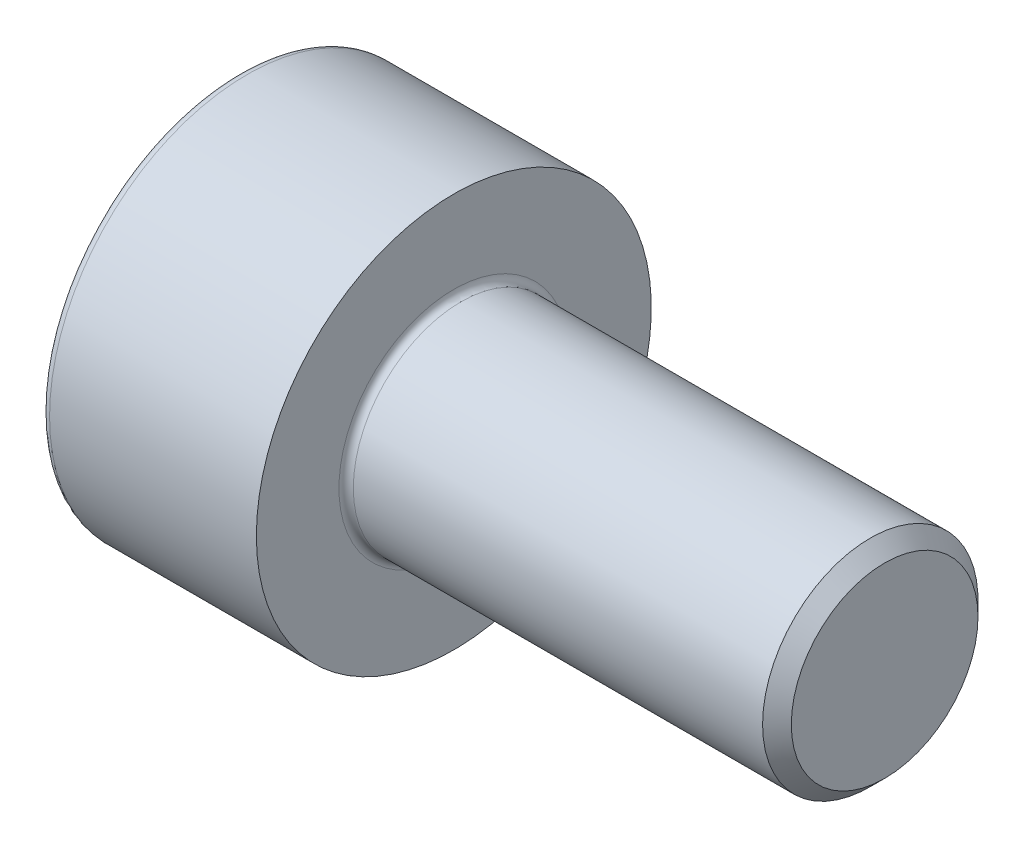
ISO-10303-21;
HEADER;
FILE_DESCRIPTION(('STEP AP214'),'2;1');
FILE_NAME('part.step','',(''),(''),'','','');
FILE_SCHEMA(('AUTOMOTIVE_DESIGN { 1 0 10303 214 1 1 1 1 }'));
ENDSEC;
DATA;
#1=APPLICATION_CONTEXT('core data for automotive mechanical design processes');
#2=APPLICATION_PROTOCOL_DEFINITION('international standard','automotive_design',2000,#1);
#3=PRODUCT_CONTEXT('',#1,'mechanical');
#4=PRODUCT('Part','Part','',(#3));
#5=PRODUCT_RELATED_PRODUCT_CATEGORY('part','',(#4));
#6=PRODUCT_DEFINITION_FORMATION('','',#4);
#7=PRODUCT_DEFINITION_CONTEXT('part definition',#1,'design');
#8=PRODUCT_DEFINITION('design','',#6,#7);
#9=PRODUCT_DEFINITION_SHAPE('','',#8);
#10=(LENGTH_UNIT() NAMED_UNIT(*) SI_UNIT(.MILLI.,.METRE.));
#11=(NAMED_UNIT(*) PLANE_ANGLE_UNIT() SI_UNIT($,.RADIAN.));
#12=(NAMED_UNIT(*) SI_UNIT($,.STERADIAN.) SOLID_ANGLE_UNIT());
#13=UNCERTAINTY_MEASURE_WITH_UNIT(LENGTH_MEASURE(1.E-05),#10,'distance_accuracy_value','');
#14=(GEOMETRIC_REPRESENTATION_CONTEXT(3) GLOBAL_UNCERTAINTY_ASSIGNED_CONTEXT((#13)) GLOBAL_UNIT_ASSIGNED_CONTEXT((#10,
#11,#12)) REPRESENTATION_CONTEXT('',''));
#15=CARTESIAN_POINT('',(0.,0.,0.));
#16=DIRECTION('',(0.,0.,1.));
#17=DIRECTION('',(1.,0.,0.));
#18=AXIS2_PLACEMENT_3D('',#15,#16,#17);
#19=CARTESIAN_POINT('',(9.,0.,0.));
#20=DIRECTION('',(-1.,0.,0.));
#21=DIRECTION('',(0.,0.,1.));
#22=AXIS2_PLACEMENT_3D('',#19,#20,#21);
#23=PLANE('',#22);
#24=CARTESIAN_POINT('',(9.,0.,0.));
#25=DIRECTION('',(-1.,0.,0.));
#26=DIRECTION('',(0.,0.,1.));
#27=AXIS2_PLACEMENT_3D('',#24,#25,#26);
#28=CIRCLE('',#27,1.3);
#29=CARTESIAN_POINT('',(9.,0.,1.3));
#30=VERTEX_POINT('',#29);
#31=EDGE_CURVE('E11',#30,#30,#28,.F.);
#32=ORIENTED_EDGE('',*,*,#31,.T.);
#33=EDGE_LOOP('',(#32));
#34=FACE_BOUND('',#33,.T.);
#35=ADVANCED_FACE('F37',(#34),#23,.F.);
#36=CARTESIAN_POINT('',(0.,0.,0.));
#37=DIRECTION('',(-1.,0.,0.));
#38=DIRECTION('',(0.,0.,1.));
#39=AXIS2_PLACEMENT_3D('',#36,#37,#38);
#40=CYLINDRICAL_SURFACE('',#39,1.5);
#41=CARTESIAN_POINT('',(8.8,0.,0.));
#42=DIRECTION('',(-1.,0.,0.));
#43=DIRECTION('',(0.,0.,1.));
#44=AXIS2_PLACEMENT_3D('',#41,#42,#43);
#45=CIRCLE('',#44,1.5);
#46=CARTESIAN_POINT('',(8.8,0.,1.5));
#47=VERTEX_POINT('',#46);
#48=EDGE_CURVE('E45',#47,#47,#45,.T.);
#49=ORIENTED_EDGE('',*,*,#48,.T.);
#50=EDGE_LOOP('',(#49));
#51=FACE_BOUND('',#50,.T.);
#52=CARTESIAN_POINT('',(3.1,0.,0.));
#53=DIRECTION('',(1.,0.,0.));
#54=DIRECTION('',(0.,0.,-1.));
#55=AXIS2_PLACEMENT_3D('',#52,#53,#54);
#56=CIRCLE('',#55,1.5);
#57=CARTESIAN_POINT('',(3.1,0.,-1.5));
#58=VERTEX_POINT('',#57);
#59=EDGE_CURVE('E150',#58,#58,#56,.T.);
#60=ORIENTED_EDGE('',*,*,#59,.T.);
#61=EDGE_LOOP('',(#60));
#62=FACE_BOUND('',#61,.T.);
#63=ADVANCED_FACE('F161',(#51,#62),#40,.T.);
#64=CARTESIAN_POINT('',(3.,0.,0.));
#65=DIRECTION('',(1.,0.,0.));
#66=DIRECTION('',(0.,0.,-1.));
#67=AXIS2_PLACEMENT_3D('',#64,#65,#66);
#68=PLANE('',#67);
#69=CARTESIAN_POINT('',(3.,0.,0.));
#70=DIRECTION('',(1.,0.,0.));
#71=DIRECTION('',(0.,0.,-1.));
#72=AXIS2_PLACEMENT_3D('',#69,#70,#71);
#73=CIRCLE('',#72,1.6);
#74=CARTESIAN_POINT('',(3.,0.,-1.6));
#75=VERTEX_POINT('',#74);
#76=EDGE_CURVE('E147',#75,#75,#73,.F.);
#77=ORIENTED_EDGE('',*,*,#76,.T.);
#78=EDGE_LOOP('',(#77));
#79=FACE_BOUND('',#78,.T.);
#80=CARTESIAN_POINT('',(3.,0.,0.));
#81=DIRECTION('',(-1.,0.,0.));
#82=DIRECTION('',(0.,0.,1.));
#83=AXIS2_PLACEMENT_3D('',#80,#81,#82);
#84=CIRCLE('',#83,2.75);
#85=CARTESIAN_POINT('',(3.,0.,2.75));
#86=VERTEX_POINT('',#85);
#87=EDGE_CURVE('E139',#86,#86,#84,.T.);
#88=ORIENTED_EDGE('',*,*,#87,.F.);
#89=EDGE_LOOP('',(#88));
#90=FACE_BOUND('',#89,.T.);
#91=ADVANCED_FACE('F183',(#79,#90),#68,.T.);
#92=CARTESIAN_POINT('',(0.,0.,0.));
#93=DIRECTION('',(-1.,0.,0.));
#94=DIRECTION('',(0.,0.,1.));
#95=AXIS2_PLACEMENT_3D('',#92,#93,#94);
#96=CYLINDRICAL_SURFACE('',#95,2.75);
#97=CARTESIAN_POINT('',(0.12,0.,0.));
#98=DIRECTION('',(-1.,0.,0.));
#99=DIRECTION('',(0.,0.,1.));
#100=AXIS2_PLACEMENT_3D('',#97,#98,#99);
#101=CIRCLE('',#100,2.75);
#102=CARTESIAN_POINT('',(0.12,0.,2.75));
#103=VERTEX_POINT('',#102);
#104=EDGE_CURVE('E156',#103,#103,#101,.F.);
#105=ORIENTED_EDGE('',*,*,#104,.T.);
#106=EDGE_LOOP('',(#105));
#107=FACE_BOUND('',#106,.T.);
#108=ORIENTED_EDGE('',*,*,#87,.T.);
#109=EDGE_LOOP('',(#108));
#110=FACE_BOUND('',#109,.T.);
#111=ADVANCED_FACE('F193',(#107,#110),#96,.T.);
#112=CARTESIAN_POINT('',(0.,0.,0.));
#113=DIRECTION('',(-1.,0.,0.));
#114=DIRECTION('',(0.,0.,1.));
#115=AXIS2_PLACEMENT_3D('',#112,#113,#114);
#116=PLANE('',#115);
#117=DIRECTION('',(0.,0.5,-0.866025403784439));
#118=VECTOR('',#117,1.);
#119=CARTESIAN_POINT('',(0.,0.721687836487033,1.25));
#120=LINE('',#119,#118);
#121=CARTESIAN_POINT('',(0.,0.721687836487033,1.25));
#122=VERTEX_POINT('',#121);
#123=CARTESIAN_POINT('',(0.,1.44337567297406,0.));
#124=VERTEX_POINT('',#123);
#125=EDGE_CURVE('E52',#122,#124,#120,.T.);
#126=ORIENTED_EDGE('',*,*,#125,.F.);
#127=DIRECTION('',(0.,1.,0.));
#128=VECTOR('',#127,1.);
#129=CARTESIAN_POINT('',(0.,-0.721687836487032,1.25));
#130=LINE('',#129,#128);
#131=CARTESIAN_POINT('',(0.,-0.721687836487032,1.25));
#132=VERTEX_POINT('',#131);
#133=EDGE_CURVE('E135',#132,#122,#130,.T.);
#134=ORIENTED_EDGE('',*,*,#133,.F.);
#135=DIRECTION('',(0.,0.5,0.866025403784439));
#136=VECTOR('',#135,1.);
#137=CARTESIAN_POINT('',(0.,-1.44337567297406,0.));
#138=LINE('',#137,#136);
#139=CARTESIAN_POINT('',(0.,-1.44337567297406,0.));
#140=VERTEX_POINT('',#139);
#141=EDGE_CURVE('E133',#140,#132,#138,.T.);
#142=ORIENTED_EDGE('',*,*,#141,.F.);
#143=DIRECTION('',(0.,-0.5,0.866025403784439));
#144=VECTOR('',#143,1.);
#145=CARTESIAN_POINT('',(0.,-0.721687836487033,-1.25));
#146=LINE('',#145,#144);
#147=CARTESIAN_POINT('',(0.,-0.721687836487033,-1.25));
#148=VERTEX_POINT('',#147);
#149=EDGE_CURVE('E100',#148,#140,#146,.T.);
#150=ORIENTED_EDGE('',*,*,#149,.F.);
#151=DIRECTION('',(0.,-1.,0.));
#152=VECTOR('',#151,1.);
#153=CARTESIAN_POINT('',(0.,0.721687836487032,-1.25));
#154=LINE('',#153,#152);
#155=CARTESIAN_POINT('',(0.,0.721687836487032,-1.25));
#156=VERTEX_POINT('',#155);
#157=EDGE_CURVE('E129',#156,#148,#154,.T.);
#158=ORIENTED_EDGE('',*,*,#157,.F.);
#159=DIRECTION('',(0.,-0.5,-0.866025403784439));
#160=VECTOR('',#159,1.);
#161=CARTESIAN_POINT('',(0.,1.44337567297406,0.));
#162=LINE('',#161,#160);
#163=EDGE_CURVE('E126',#124,#156,#162,.T.);
#164=ORIENTED_EDGE('',*,*,#163,.F.);
#165=EDGE_LOOP('',(#126,#134,#142,#150,#158,#164));
#166=FACE_BOUND('',#165,.T.);
#167=CARTESIAN_POINT('',(0.,0.,0.));
#168=DIRECTION('',(-1.,0.,0.));
#169=DIRECTION('',(0.,0.,1.));
#170=AXIS2_PLACEMENT_3D('',#167,#168,#169);
#171=CIRCLE('',#170,2.63);
#172=CARTESIAN_POINT('',(0.,0.,2.63));
#173=VERTEX_POINT('',#172);
#174=EDGE_CURVE('E153',#173,#173,#171,.T.);
#175=ORIENTED_EDGE('',*,*,#174,.T.);
#176=EDGE_LOOP('',(#175));
#177=FACE_BOUND('',#176,.T.);
#178=ADVANCED_FACE('F188',(#166,#177),#116,.T.);
#179=CARTESIAN_POINT('',(3.1,0.,0.));
#180=DIRECTION('',(1.,0.,0.));
#181=DIRECTION('',(0.,0.,-1.));
#182=AXIS2_PLACEMENT_3D('',#179,#180,#181);
#183=TOROIDAL_SURFACE('',#182,1.6,0.1);
#184=ORIENTED_EDGE('',*,*,#59,.F.);
#185=EDGE_LOOP('',(#184));
#186=FACE_BOUND('',#185,.T.);
#187=ORIENTED_EDGE('',*,*,#76,.F.);
#188=EDGE_LOOP('',(#187));
#189=FACE_BOUND('',#188,.T.);
#190=ADVANCED_FACE('F174',(#186,#189),#183,.F.);
#191=CARTESIAN_POINT('',(0.12,0.,0.));
#192=DIRECTION('',(-1.,0.,0.));
#193=DIRECTION('',(0.,0.,1.));
#194=AXIS2_PLACEMENT_3D('',#191,#192,#193);
#195=TOROIDAL_SURFACE('',#194,2.63,0.12);
#196=ORIENTED_EDGE('',*,*,#104,.F.);
#197=EDGE_LOOP('',(#196));
#198=FACE_BOUND('',#197,.T.);
#199=ORIENTED_EDGE('',*,*,#174,.F.);
#200=EDGE_LOOP('',(#199));
#201=FACE_BOUND('',#200,.T.);
#202=ADVANCED_FACE('F166',(#198,#201),#195,.T.);
#203=CARTESIAN_POINT('',(8.8,0.,0.));
#204=DIRECTION('',(-1.,0.,0.));
#205=DIRECTION('',(0.,0.,1.));
#206=AXIS2_PLACEMENT_3D('',#203,#204,#205);
#207=CONICAL_SURFACE('',#206,1.5,0.785398163397446);
#208=ORIENTED_EDGE('',*,*,#31,.F.);
#209=EDGE_LOOP('',(#208));
#210=FACE_BOUND('',#209,.T.);
#211=ORIENTED_EDGE('',*,*,#48,.F.);
#212=EDGE_LOOP('',(#211));
#213=FACE_BOUND('',#212,.T.);
#214=ADVANCED_FACE('F39',(#210,#213),#207,.T.);
#215=CARTESIAN_POINT('',(1.,0.721687836487033,1.25));
#216=DIRECTION('',(0.,0.866025403784439,0.5));
#217=DIRECTION('',(0.,-0.5,0.866025403784439));
#218=AXIS2_PLACEMENT_3D('',#215,#216,#217);
#219=PLANE('',#218);
#220=ORIENTED_EDGE('',*,*,#125,.T.);
#221=DIRECTION('',(-1.,0.,0.));
#222=VECTOR('',#221,1.);
#223=CARTESIAN_POINT('',(1.,1.44337567297406,0.));
#224=LINE('',#223,#222);
#225=CARTESIAN_POINT('',(1.,1.44337567297406,0.));
#226=VERTEX_POINT('',#225);
#227=EDGE_CURVE('E82',#226,#124,#224,.T.);
#228=ORIENTED_EDGE('',*,*,#227,.F.);
#229=DIRECTION('',(0.,0.5,-0.866025403784439));
#230=VECTOR('',#229,1.);
#231=CARTESIAN_POINT('',(1.,0.721687836487033,1.25));
#232=LINE('',#231,#230);
#233=CARTESIAN_POINT('',(1.,0.721687836487033,1.25));
#234=VERTEX_POINT('',#233);
#235=EDGE_CURVE('E137',#234,#226,#232,.T.);
#236=ORIENTED_EDGE('',*,*,#235,.F.);
#237=DIRECTION('',(-1.,0.,0.));
#238=VECTOR('',#237,1.);
#239=CARTESIAN_POINT('',(1.,0.721687836487033,1.25));
#240=LINE('',#239,#238);
#241=EDGE_CURVE('E60',#234,#122,#240,.T.);
#242=ORIENTED_EDGE('',*,*,#241,.T.);
#243=EDGE_LOOP('',(#220,#228,#236,#242));
#244=FACE_BOUND('',#243,.T.);
#245=ADVANCED_FACE('F165',(#244),#219,.F.);
#246=CARTESIAN_POINT('',(1.,-0.721687836487032,1.25));
#247=DIRECTION('',(0.,0.,1.));
#248=DIRECTION('',(0.,-1.,0.));
#249=AXIS2_PLACEMENT_3D('',#246,#247,#248);
#250=PLANE('',#249);
#251=ORIENTED_EDGE('',*,*,#133,.T.);
#252=ORIENTED_EDGE('',*,*,#241,.F.);
#253=DIRECTION('',(0.,1.,0.));
#254=VECTOR('',#253,1.);
#255=CARTESIAN_POINT('',(1.,-0.721687836487032,1.25));
#256=LINE('',#255,#254);
#257=CARTESIAN_POINT('',(1.,-0.721687836487032,1.25));
#258=VERTEX_POINT('',#257);
#259=EDGE_CURVE('E112',#258,#234,#256,.T.);
#260=ORIENTED_EDGE('',*,*,#259,.F.);
#261=DIRECTION('',(-1.,0.,0.));
#262=VECTOR('',#261,1.);
#263=CARTESIAN_POINT('',(1.,-0.721687836487032,1.25));
#264=LINE('',#263,#262);
#265=EDGE_CURVE('E104',#258,#132,#264,.T.);
#266=ORIENTED_EDGE('',*,*,#265,.T.);
#267=EDGE_LOOP('',(#251,#252,#260,#266));
#268=FACE_BOUND('',#267,.T.);
#269=ADVANCED_FACE('F172',(#268),#250,.F.);
#270=CARTESIAN_POINT('',(1.,-1.44337567297406,0.));
#271=DIRECTION('',(0.,-0.866025403784439,0.5));
#272=DIRECTION('',(0.,-0.5,-0.866025403784439));
#273=AXIS2_PLACEMENT_3D('',#270,#271,#272);
#274=PLANE('',#273);
#275=ORIENTED_EDGE('',*,*,#141,.T.);
#276=ORIENTED_EDGE('',*,*,#265,.F.);
#277=DIRECTION('',(0.,0.5,0.866025403784439));
#278=VECTOR('',#277,1.);
#279=CARTESIAN_POINT('',(1.,-1.44337567297406,0.));
#280=LINE('',#279,#278);
#281=CARTESIAN_POINT('',(1.,-1.44337567297406,0.));
#282=VERTEX_POINT('',#281);
#283=EDGE_CURVE('E108',#282,#258,#280,.T.);
#284=ORIENTED_EDGE('',*,*,#283,.F.);
#285=DIRECTION('',(-1.,0.,0.));
#286=VECTOR('',#285,1.);
#287=CARTESIAN_POINT('',(1.,-1.44337567297406,0.));
#288=LINE('',#287,#286);
#289=EDGE_CURVE('E93',#282,#140,#288,.T.);
#290=ORIENTED_EDGE('',*,*,#289,.T.);
#291=EDGE_LOOP('',(#275,#276,#284,#290));
#292=FACE_BOUND('',#291,.T.);
#293=ADVANCED_FACE('F109',(#292),#274,.F.);
#294=CARTESIAN_POINT('',(1.,-0.721687836487033,-1.25));
#295=DIRECTION('',(0.,-0.866025403784439,-0.5));
#296=DIRECTION('',(0.,0.5,-0.866025403784439));
#297=AXIS2_PLACEMENT_3D('',#294,#295,#296);
#298=PLANE('',#297);
#299=ORIENTED_EDGE('',*,*,#149,.T.);
#300=ORIENTED_EDGE('',*,*,#289,.F.);
#301=DIRECTION('',(0.,-0.5,0.866025403784439));
#302=VECTOR('',#301,1.);
#303=CARTESIAN_POINT('',(1.,-0.721687836487033,-1.25));
#304=LINE('',#303,#302);
#305=CARTESIAN_POINT('',(1.,-0.721687836487033,-1.25));
#306=VERTEX_POINT('',#305);
#307=EDGE_CURVE('E97',#306,#282,#304,.T.);
#308=ORIENTED_EDGE('',*,*,#307,.F.);
#309=DIRECTION('',(-1.,0.,0.));
#310=VECTOR('',#309,1.);
#311=CARTESIAN_POINT('',(1.,-0.721687836487033,-1.25));
#312=LINE('',#311,#310);
#313=EDGE_CURVE('E105',#306,#148,#312,.T.);
#314=ORIENTED_EDGE('',*,*,#313,.T.);
#315=EDGE_LOOP('',(#299,#300,#308,#314));
#316=FACE_BOUND('',#315,.T.);
#317=ADVANCED_FACE('F95',(#316),#298,.F.);
#318=CARTESIAN_POINT('',(1.,0.721687836487032,-1.25));
#319=DIRECTION('',(0.,0.,-1.));
#320=DIRECTION('',(0.,1.,0.));
#321=AXIS2_PLACEMENT_3D('',#318,#319,#320);
#322=PLANE('',#321);
#323=ORIENTED_EDGE('',*,*,#157,.T.);
#324=ORIENTED_EDGE('',*,*,#313,.F.);
#325=DIRECTION('',(0.,-1.,0.));
#326=VECTOR('',#325,1.);
#327=CARTESIAN_POINT('',(1.,0.721687836487032,-1.25));
#328=LINE('',#327,#326);
#329=CARTESIAN_POINT('',(1.,0.721687836487032,-1.25));
#330=VERTEX_POINT('',#329);
#331=EDGE_CURVE('E118',#330,#306,#328,.T.);
#332=ORIENTED_EDGE('',*,*,#331,.F.);
#333=DIRECTION('',(-1.,0.,0.));
#334=VECTOR('',#333,1.);
#335=CARTESIAN_POINT('',(1.,0.721687836487032,-1.25));
#336=LINE('',#335,#334);
#337=EDGE_CURVE('E142',#330,#156,#336,.T.);
#338=ORIENTED_EDGE('',*,*,#337,.T.);
#339=EDGE_LOOP('',(#323,#324,#332,#338));
#340=FACE_BOUND('',#339,.T.);
#341=ADVANCED_FACE('F213',(#340),#322,.F.);
#342=CARTESIAN_POINT('',(1.,1.44337567297406,0.));
#343=DIRECTION('',(0.,0.866025403784439,-0.5));
#344=DIRECTION('',(0.,0.5,0.866025403784439));
#345=AXIS2_PLACEMENT_3D('',#342,#343,#344);
#346=PLANE('',#345);
#347=ORIENTED_EDGE('',*,*,#163,.T.);
#348=ORIENTED_EDGE('',*,*,#337,.F.);
#349=DIRECTION('',(0.,-0.5,-0.866025403784439));
#350=VECTOR('',#349,1.);
#351=CARTESIAN_POINT('',(1.,1.44337567297406,0.));
#352=LINE('',#351,#350);
#353=EDGE_CURVE('E120',#226,#330,#352,.T.);
#354=ORIENTED_EDGE('',*,*,#353,.F.);
#355=ORIENTED_EDGE('',*,*,#227,.T.);
#356=EDGE_LOOP('',(#347,#348,#354,#355));
#357=FACE_BOUND('',#356,.T.);
#358=ADVANCED_FACE('F210',(#357),#346,.F.);
#359=CARTESIAN_POINT('',(1.,0.,0.));
#360=DIRECTION('',(-1.,0.,0.));
#361=DIRECTION('',(0.,0.,1.));
#362=AXIS2_PLACEMENT_3D('',#359,#360,#361);
#363=PLANE('',#362);
#364=ORIENTED_EDGE('',*,*,#235,.T.);
#365=ORIENTED_EDGE('',*,*,#353,.T.);
#366=ORIENTED_EDGE('',*,*,#331,.T.);
#367=ORIENTED_EDGE('',*,*,#307,.T.);
#368=ORIENTED_EDGE('',*,*,#283,.T.);
#369=ORIENTED_EDGE('',*,*,#259,.T.);
#370=EDGE_LOOP('',(#364,#365,#366,#367,#368,#369));
#371=FACE_BOUND('',#370,.T.);
#372=ADVANCED_FACE('F115',(#371),#363,.T.);
#373=CLOSED_SHELL('',(#35,#63,#91,#111,#178,#190,#202,#214,#245,#269,#293,#317,#341,#358,#372));
#374=MANIFOLD_SOLID_BREP('B2',#373);
#375=ADVANCED_BREP_SHAPE_REPRESENTATION('',(#18,#374),#14);
#376=SHAPE_DEFINITION_REPRESENTATION(#9,#375);
ENDSEC;
END-ISO-10303-21;
